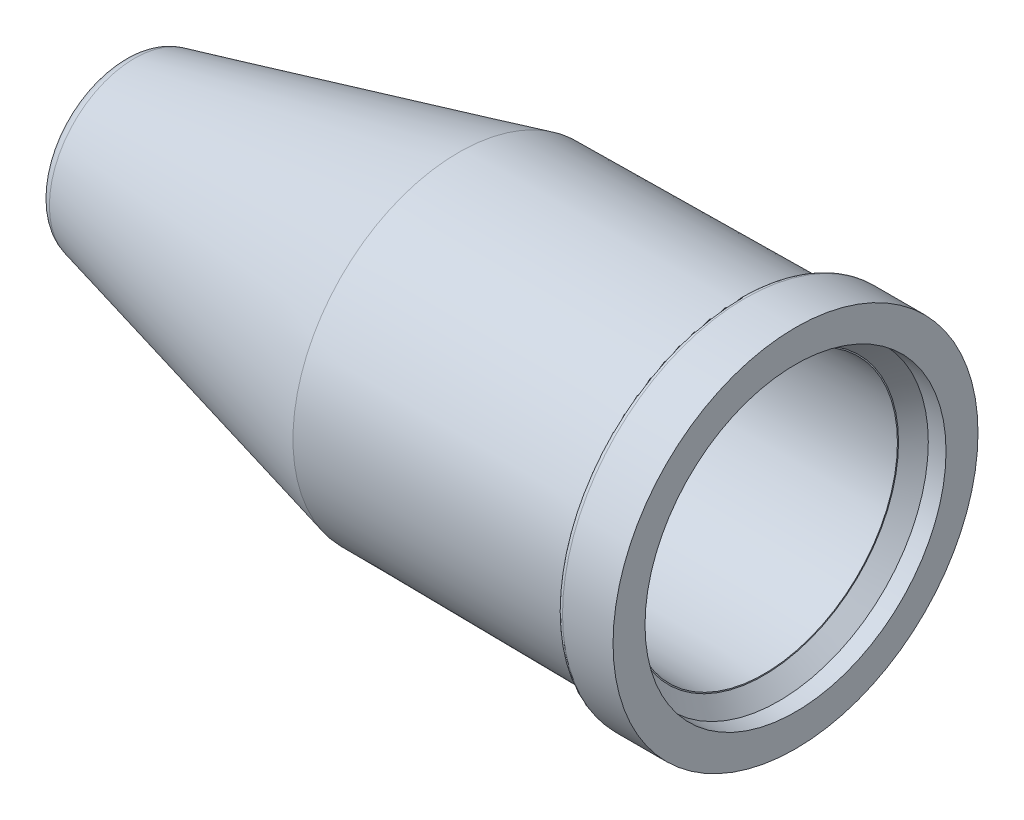
ISO-10303-21;
HEADER;
FILE_DESCRIPTION(('STEP AP214'),'2;1');
FILE_NAME('part.step','',(''),(''),'','','');
FILE_SCHEMA(('AUTOMOTIVE_DESIGN { 1 0 10303 214 1 1 1 1 }'));
ENDSEC;
DATA;
#1=APPLICATION_CONTEXT('core data for automotive mechanical design processes');
#2=APPLICATION_PROTOCOL_DEFINITION('international standard','automotive_design',2000,#1);
#3=PRODUCT_CONTEXT('',#1,'mechanical');
#4=PRODUCT('Part','Part','',(#3));
#5=PRODUCT_RELATED_PRODUCT_CATEGORY('part','',(#4));
#6=PRODUCT_DEFINITION_FORMATION('','',#4);
#7=PRODUCT_DEFINITION_CONTEXT('part definition',#1,'design');
#8=PRODUCT_DEFINITION('design','',#6,#7);
#9=PRODUCT_DEFINITION_SHAPE('','',#8);
#10=(LENGTH_UNIT() NAMED_UNIT(*) SI_UNIT(.MILLI.,.METRE.));
#11=(NAMED_UNIT(*) PLANE_ANGLE_UNIT() SI_UNIT($,.RADIAN.));
#12=(NAMED_UNIT(*) SI_UNIT($,.STERADIAN.) SOLID_ANGLE_UNIT());
#13=UNCERTAINTY_MEASURE_WITH_UNIT(LENGTH_MEASURE(1.E-05),#10,'distance_accuracy_value','');
#14=(GEOMETRIC_REPRESENTATION_CONTEXT(3) GLOBAL_UNCERTAINTY_ASSIGNED_CONTEXT((#13)) GLOBAL_UNIT_ASSIGNED_CONTEXT((#10,
#11,#12)) REPRESENTATION_CONTEXT('',''));
#15=CARTESIAN_POINT('',(0.,0.,0.));
#16=DIRECTION('',(0.,0.,1.));
#17=DIRECTION('',(1.,0.,0.));
#18=AXIS2_PLACEMENT_3D('',#15,#16,#17);
#19=CARTESIAN_POINT('',(-12.,1.45996726,0.));
#20=DIRECTION('',(-1.,0.,0.));
#21=DIRECTION('',(0.,0.,1.));
#22=AXIS2_PLACEMENT_3D('',#19,#20,#21);
#23=PLANE('',#22);
#24=CARTESIAN_POINT('',(-12.,0.,0.));
#25=DIRECTION('',(-1.,0.,0.));
#26=DIRECTION('',(0.,0.,1.));
#27=AXIS2_PLACEMENT_3D('',#24,#25,#26);
#28=CIRCLE('',#27,1.22539441304672);
#29=CARTESIAN_POINT('',(-12.,0.,1.22539441304672));
#30=VERTEX_POINT('',#29);
#31=EDGE_CURVE('E49',#30,#30,#28,.T.);
#32=ORIENTED_EDGE('',*,*,#31,.T.);
#33=EDGE_LOOP('',(#32));
#34=FACE_BOUND('',#33,.T.);
#35=CARTESIAN_POINT('',(-12.,0.,0.));
#36=DIRECTION('',(1.,0.,0.));
#37=DIRECTION('',(0.,0.,-1.));
#38=AXIS2_PLACEMENT_3D('',#35,#36,#37);
#39=CIRCLE('',#38,1.182);
#40=CARTESIAN_POINT('',(-12.,0.,-1.182));
#41=VERTEX_POINT('',#40);
#42=EDGE_CURVE('E135',#41,#41,#39,.T.);
#43=ORIENTED_EDGE('',*,*,#42,.T.);
#44=EDGE_LOOP('',(#43));
#45=FACE_BOUND('',#44,.T.);
#46=ADVANCED_FACE('F34',(#34,#45),#23,.T.);
#47=CARTESIAN_POINT('',(-6.,0.,0.));
#48=DIRECTION('',(1.,0.,0.));
#49=DIRECTION('',(0.,0.,-1.));
#50=AXIS2_PLACEMENT_3D('',#47,#48,#49);
#51=CONICAL_SURFACE('',#50,2.951,0.243571540210647);
#52=CARTESIAN_POINT('',(-11.77235108269,0.,0.));
#53=DIRECTION('',(-1.,0.,0.));
#54=DIRECTION('',(0.,0.,1.));
#55=AXIS2_PLACEMENT_3D('',#52,#53,#54);
#56=CIRCLE('',#55,1.5165392581558);
#57=CARTESIAN_POINT('',(-11.77235108269,0.,1.5165392581558));
#58=VERTEX_POINT('',#57);
#59=EDGE_CURVE('E53',#58,#58,#56,.F.);
#60=ORIENTED_EDGE('',*,*,#59,.T.);
#61=EDGE_LOOP('',(#60));
#62=FACE_BOUND('',#61,.T.);
#63=CARTESIAN_POINT('',(-6.,0.,0.));
#64=DIRECTION('',(1.,0.,0.));
#65=DIRECTION('',(0.,0.,-1.));
#66=AXIS2_PLACEMENT_3D('',#63,#64,#65);
#67=CIRCLE('',#66,2.951);
#68=CARTESIAN_POINT('',(-6.,0.,-2.951));
#69=VERTEX_POINT('',#68);
#70=EDGE_CURVE('E58',#69,#69,#67,.T.);
#71=ORIENTED_EDGE('',*,*,#70,.F.);
#72=EDGE_LOOP('',(#71));
#73=FACE_BOUND('',#72,.T.);
#74=ADVANCED_FACE('F155',(#62,#73),#51,.T.);
#75=CARTESIAN_POINT('',(-1.,0.,0.));
#76=DIRECTION('',(1.,0.,0.));
#77=DIRECTION('',(0.,0.,-1.));
#78=AXIS2_PLACEMENT_3D('',#75,#76,#77);
#79=CONICAL_SURFACE('',#78,3.,0.00979968628741051);
#80=ORIENTED_EDGE('',*,*,#70,.T.);
#81=EDGE_LOOP('',(#80));
#82=FACE_BOUND('',#81,.T.);
#83=CARTESIAN_POINT('',(-1.,0.,0.));
#84=DIRECTION('',(1.,0.,0.));
#85=DIRECTION('',(0.,0.,-1.));
#86=AXIS2_PLACEMENT_3D('',#83,#84,#85);
#87=CIRCLE('',#86,3.);
#88=CARTESIAN_POINT('',(-1.,0.,-3.));
#89=VERTEX_POINT('',#88);
#90=EDGE_CURVE('E62',#89,#89,#87,.T.);
#91=ORIENTED_EDGE('',*,*,#90,.F.);
#92=EDGE_LOOP('',(#91));
#93=FACE_BOUND('',#92,.T.);
#94=ADVANCED_FACE('F161',(#82,#93),#79,.T.);
#95=CARTESIAN_POINT('',(-1.,3.25,0.));
#96=DIRECTION('',(-1.,0.,0.));
#97=DIRECTION('',(0.,0.,1.));
#98=AXIS2_PLACEMENT_3D('',#95,#96,#97);
#99=PLANE('',#98);
#100=CARTESIAN_POINT('',(-1.,0.,0.));
#101=DIRECTION('',(-1.,0.,0.));
#102=DIRECTION('',(0.,0.,1.));
#103=AXIS2_PLACEMENT_3D('',#100,#101,#102);
#104=CIRCLE('',#103,3.15);
#105=CARTESIAN_POINT('',(-1.,0.,3.15));
#106=VERTEX_POINT('',#105);
#107=EDGE_CURVE('E10',#106,#106,#104,.T.);
#108=ORIENTED_EDGE('',*,*,#107,.T.);
#109=EDGE_LOOP('',(#108));
#110=FACE_BOUND('',#109,.T.);
#111=ORIENTED_EDGE('',*,*,#90,.T.);
#112=EDGE_LOOP('',(#111));
#113=FACE_BOUND('',#112,.T.);
#114=ADVANCED_FACE('F167',(#110,#113),#99,.T.);
#115=CARTESIAN_POINT('',(3.,0.,0.));
#116=DIRECTION('',(1.,0.,0.));
#117=DIRECTION('',(0.,0.,-1.));
#118=AXIS2_PLACEMENT_3D('',#115,#116,#117);
#119=CYLINDRICAL_SURFACE('',#118,3.25);
#120=CARTESIAN_POINT('',(-0.9,0.,0.));
#121=DIRECTION('',(-1.,0.,0.));
#122=DIRECTION('',(0.,0.,1.));
#123=AXIS2_PLACEMENT_3D('',#120,#121,#122);
#124=CIRCLE('',#123,3.25);
#125=CARTESIAN_POINT('',(-0.9,0.,3.25));
#126=VERTEX_POINT('',#125);
#127=EDGE_CURVE('E42',#126,#126,#124,.F.);
#128=ORIENTED_EDGE('',*,*,#127,.T.);
#129=EDGE_LOOP('',(#128));
#130=FACE_BOUND('',#129,.T.);
#131=CARTESIAN_POINT('',(0.,0.,0.));
#132=DIRECTION('',(1.,0.,0.));
#133=DIRECTION('',(0.,0.,-1.));
#134=AXIS2_PLACEMENT_3D('',#131,#132,#133);
#135=CIRCLE('',#134,3.25);
#136=CARTESIAN_POINT('',(0.,0.,-3.25));
#137=VERTEX_POINT('',#136);
#138=EDGE_CURVE('E65',#137,#137,#135,.T.);
#139=ORIENTED_EDGE('',*,*,#138,.F.);
#140=EDGE_LOOP('',(#139));
#141=FACE_BOUND('',#140,.T.);
#142=ADVANCED_FACE('F171',(#130,#141),#119,.T.);
#143=CARTESIAN_POINT('',(0.,2.68072233378491,0.));
#144=DIRECTION('',(1.,0.,0.));
#145=DIRECTION('',(0.,0.,-1.));
#146=AXIS2_PLACEMENT_3D('',#143,#144,#145);
#147=PLANE('',#146);
#148=ORIENTED_EDGE('',*,*,#138,.T.);
#149=EDGE_LOOP('',(#148));
#150=FACE_BOUND('',#149,.T.);
#151=CARTESIAN_POINT('',(0.,0.,0.));
#152=DIRECTION('',(1.,0.,0.));
#153=DIRECTION('',(0.,0.,-1.));
#154=AXIS2_PLACEMENT_3D('',#151,#152,#153);
#155=CIRCLE('',#154,2.68072233378491);
#156=CARTESIAN_POINT('',(0.,0.,-2.68072233378491));
#157=VERTEX_POINT('',#156);
#158=EDGE_CURVE('E68',#157,#157,#155,.T.);
#159=ORIENTED_EDGE('',*,*,#158,.F.);
#160=EDGE_LOOP('',(#159));
#161=FACE_BOUND('',#160,.T.);
#162=ADVANCED_FACE('F174',(#150,#161),#147,.T.);
#163=CARTESIAN_POINT('',(-0.3,0.,0.));
#164=DIRECTION('',(1.,0.,0.));
#165=DIRECTION('',(0.,0.,-1.));
#166=AXIS2_PLACEMENT_3D('',#163,#164,#165);
#167=CONICAL_SURFACE('',#166,2.665,0.052359877559822);
#168=ORIENTED_EDGE('',*,*,#158,.T.);
#169=EDGE_LOOP('',(#168));
#170=FACE_BOUND('',#169,.T.);
#171=CARTESIAN_POINT('',(-0.3,0.,0.));
#172=DIRECTION('',(1.,0.,0.));
#173=DIRECTION('',(0.,0.,-1.));
#174=AXIS2_PLACEMENT_3D('',#171,#172,#173);
#175=CIRCLE('',#174,2.665);
#176=CARTESIAN_POINT('',(-0.3,0.,-2.665));
#177=VERTEX_POINT('',#176);
#178=EDGE_CURVE('E71',#177,#177,#175,.T.);
#179=ORIENTED_EDGE('',*,*,#178,.F.);
#180=EDGE_LOOP('',(#179));
#181=FACE_BOUND('',#180,.T.);
#182=ADVANCED_FACE('F177',(#170,#181),#167,.F.);
#183=CARTESIAN_POINT('',(-0.3,0.,0.));
#184=DIRECTION('',(1.,0.,0.));
#185=DIRECTION('',(0.,0.,-1.));
#186=AXIS2_PLACEMENT_3D('',#183,#184,#185);
#187=CONICAL_SURFACE('',#186,2.665,0.785398163397452);
#188=CARTESIAN_POINT('',(-0.564999999999998,0.,0.));
#189=DIRECTION('',(1.,0.,0.));
#190=DIRECTION('',(0.,0.,-1.));
#191=AXIS2_PLACEMENT_3D('',#188,#189,#190);
#192=CIRCLE('',#191,2.4);
#193=CARTESIAN_POINT('',(-0.564999999999998,0.,-2.4));
#194=VERTEX_POINT('',#193);
#195=EDGE_CURVE('E74',#194,#194,#192,.T.);
#196=ORIENTED_EDGE('',*,*,#195,.F.);
#197=EDGE_LOOP('',(#196));
#198=FACE_BOUND('',#197,.T.);
#199=ORIENTED_EDGE('',*,*,#178,.T.);
#200=EDGE_LOOP('',(#199));
#201=FACE_BOUND('',#200,.T.);
#202=ADVANCED_FACE('F181',(#198,#201),#187,.F.);
#203=CARTESIAN_POINT('',(-0.564999999999998,2.38,0.));
#204=DIRECTION('',(1.,0.,0.));
#205=DIRECTION('',(0.,0.,-1.));
#206=AXIS2_PLACEMENT_3D('',#203,#204,#205);
#207=PLANE('',#206);
#208=ORIENTED_EDGE('',*,*,#195,.T.);
#209=EDGE_LOOP('',(#208));
#210=FACE_BOUND('',#209,.T.);
#211=CARTESIAN_POINT('',(-0.564999999999998,0.,0.));
#212=DIRECTION('',(1.,0.,0.));
#213=DIRECTION('',(0.,0.,-1.));
#214=AXIS2_PLACEMENT_3D('',#211,#212,#213);
#215=CIRCLE('',#214,2.38);
#216=CARTESIAN_POINT('',(-0.564999999999998,0.,-2.38));
#217=VERTEX_POINT('',#216);
#218=EDGE_CURVE('E77',#217,#217,#215,.T.);
#219=ORIENTED_EDGE('',*,*,#218,.F.);
#220=EDGE_LOOP('',(#219));
#221=FACE_BOUND('',#220,.T.);
#222=ADVANCED_FACE('F185',(#210,#221),#207,.T.);
#223=CARTESIAN_POINT('',(-6.81,0.,0.));
#224=DIRECTION('',(1.,0.,0.));
#225=DIRECTION('',(0.,0.,-1.));
#226=AXIS2_PLACEMENT_3D('',#223,#224,#225);
#227=CONICAL_SURFACE('',#226,2.32675113436465,0.00852643318342214);
#228=ORIENTED_EDGE('',*,*,#218,.T.);
#229=EDGE_LOOP('',(#228));
#230=FACE_BOUND('',#229,.T.);
#231=CARTESIAN_POINT('',(-6.81,0.,0.));
#232=DIRECTION('',(1.,0.,0.));
#233=DIRECTION('',(0.,0.,-1.));
#234=AXIS2_PLACEMENT_3D('',#231,#232,#233);
#235=CIRCLE('',#234,2.32675113436465);
#236=CARTESIAN_POINT('',(-6.81,0.,-2.32675113436465));
#237=VERTEX_POINT('',#236);
#238=EDGE_CURVE('E80',#237,#237,#235,.T.);
#239=ORIENTED_EDGE('',*,*,#238,.F.);
#240=EDGE_LOOP('',(#239));
#241=FACE_BOUND('',#240,.T.);
#242=ADVANCED_FACE('F189',(#230,#241),#227,.F.);
#243=CARTESIAN_POINT('',(-6.81,0.,0.));
#244=DIRECTION('',(1.,0.,0.));
#245=DIRECTION('',(0.,0.,-1.));
#246=AXIS2_PLACEMENT_3D('',#243,#244,#245);
#247=CONICAL_SURFACE('',#246,2.32675113436465,0.270526034059121);
#248=CARTESIAN_POINT('',(-7.5,0.,0.));
#249=DIRECTION('',(1.,0.,0.));
#250=DIRECTION('',(0.,0.,-1.));
#251=AXIS2_PLACEMENT_3D('',#248,#249,#250);
#252=CIRCLE('',#251,2.13539719896336);
#253=CARTESIAN_POINT('',(-7.5,0.,-2.13539719896336));
#254=VERTEX_POINT('',#253);
#255=EDGE_CURVE('E83',#254,#254,#252,.T.);
#256=ORIENTED_EDGE('',*,*,#255,.F.);
#257=EDGE_LOOP('',(#256));
#258=FACE_BOUND('',#257,.T.);
#259=ORIENTED_EDGE('',*,*,#238,.T.);
#260=EDGE_LOOP('',(#259));
#261=FACE_BOUND('',#260,.T.);
#262=ADVANCED_FACE('F193',(#258,#261),#247,.F.);
#263=CARTESIAN_POINT('',(-7.89008195503873,0.,0.));
#264=DIRECTION('',(1.,0.,0.));
#265=DIRECTION('',(0.,0.,-1.));
#266=AXIS2_PLACEMENT_3D('',#263,#264,#265);
#267=TOROIDAL_SURFACE('',#266,2.4319373621001,0.489999999999999);
#268=ORIENTED_EDGE('',*,*,#255,.T.);
#269=EDGE_LOOP('',(#268));
#270=FACE_BOUND('',#269,.T.);
#271=CARTESIAN_POINT('',(-8.07171797673641,0.,0.));
#272=DIRECTION('',(1.,0.,0.));
#273=DIRECTION('',(0.,0.,-1.));
#274=AXIS2_PLACEMENT_3D('',#271,#272,#273);
#275=CIRCLE('',#274,1.97684577173412);
#276=CARTESIAN_POINT('',(-8.07171797673641,0.,-1.97684577173412));
#277=VERTEX_POINT('',#276);
#278=EDGE_CURVE('E86',#277,#277,#275,.T.);
#279=ORIENTED_EDGE('',*,*,#278,.F.);
#280=EDGE_LOOP('',(#279));
#281=FACE_BOUND('',#280,.T.);
#282=ADVANCED_FACE('F197',(#270,#281),#267,.T.);
#283=CARTESIAN_POINT('',(-9.53,0.,0.));
#284=DIRECTION('',(1.,0.,0.));
#285=DIRECTION('',(0.,0.,-1.));
#286=AXIS2_PLACEMENT_3D('',#283,#284,#285);
#287=CONICAL_SURFACE('',#286,1.57242837452189,0.270526034059122);
#288=ORIENTED_EDGE('',*,*,#278,.T.);
#289=EDGE_LOOP('',(#288));
#290=FACE_BOUND('',#289,.T.);
#291=CARTESIAN_POINT('',(-9.53,0.,0.));
#292=DIRECTION('',(1.,0.,0.));
#293=DIRECTION('',(0.,0.,-1.));
#294=AXIS2_PLACEMENT_3D('',#291,#292,#293);
#295=CIRCLE('',#294,1.57242837452189);
#296=CARTESIAN_POINT('',(-9.53,0.,-1.57242837452189));
#297=VERTEX_POINT('',#296);
#298=EDGE_CURVE('E89',#297,#297,#295,.T.);
#299=ORIENTED_EDGE('',*,*,#298,.F.);
#300=EDGE_LOOP('',(#299));
#301=FACE_BOUND('',#300,.T.);
#302=ADVANCED_FACE('F201',(#290,#301),#287,.F.);
#303=CARTESIAN_POINT('',(-9.53,1.475,0.));
#304=DIRECTION('',(1.,0.,0.));
#305=DIRECTION('',(0.,0.,-1.));
#306=AXIS2_PLACEMENT_3D('',#303,#304,#305);
#307=PLANE('',#306);
#308=ORIENTED_EDGE('',*,*,#298,.T.);
#309=EDGE_LOOP('',(#308));
#310=FACE_BOUND('',#309,.T.);
#311=CARTESIAN_POINT('',(-9.53,0.,0.));
#312=DIRECTION('',(1.,0.,0.));
#313=DIRECTION('',(0.,0.,-1.));
#314=AXIS2_PLACEMENT_3D('',#311,#312,#313);
#315=CIRCLE('',#314,1.475);
#316=CARTESIAN_POINT('',(-9.53,0.,-1.475));
#317=VERTEX_POINT('',#316);
#318=EDGE_CURVE('E92',#317,#317,#315,.T.);
#319=ORIENTED_EDGE('',*,*,#318,.F.);
#320=EDGE_LOOP('',(#319));
#321=FACE_BOUND('',#320,.T.);
#322=ADVANCED_FACE('F205',(#310,#321),#307,.T.);
#323=CARTESIAN_POINT('',(3.,0.,0.));
#324=DIRECTION('',(1.,0.,0.));
#325=DIRECTION('',(0.,0.,-1.));
#326=AXIS2_PLACEMENT_3D('',#323,#324,#325);
#327=CYLINDRICAL_SURFACE('',#326,1.475);
#328=CARTESIAN_POINT('',(-7.28,0.,0.));
#329=DIRECTION('',(1.,0.,0.));
#330=DIRECTION('',(0.,0.,-1.));
#331=AXIS2_PLACEMENT_3D('',#328,#329,#330);
#332=CIRCLE('',#331,1.475);
#333=CARTESIAN_POINT('',(-7.28,0.,-1.475));
#334=VERTEX_POINT('',#333);
#335=EDGE_CURVE('E95',#334,#334,#332,.T.);
#336=ORIENTED_EDGE('',*,*,#335,.F.);
#337=EDGE_LOOP('',(#336));
#338=FACE_BOUND('',#337,.T.);
#339=ORIENTED_EDGE('',*,*,#318,.T.);
#340=EDGE_LOOP('',(#339));
#341=FACE_BOUND('',#340,.T.);
#342=ADVANCED_FACE('F209',(#338,#341),#327,.T.);
#343=CARTESIAN_POINT('',(-7.28,1.10837438423645,0.));
#344=DIRECTION('',(1.,0.,0.));
#345=DIRECTION('',(0.,0.,-1.));
#346=AXIS2_PLACEMENT_3D('',#343,#344,#345);
#347=PLANE('',#346);
#348=CARTESIAN_POINT('',(-7.28,0.,0.));
#349=DIRECTION('',(1.,0.,0.));
#350=DIRECTION('',(0.,0.,-1.));
#351=AXIS2_PLACEMENT_3D('',#348,#349,#350);
#352=CIRCLE('',#351,1.10837438423645);
#353=CARTESIAN_POINT('',(-7.28,0.,-1.10837438423645));
#354=VERTEX_POINT('',#353);
#355=EDGE_CURVE('E98',#354,#354,#352,.T.);
#356=ORIENTED_EDGE('',*,*,#355,.F.);
#357=EDGE_LOOP('',(#356));
#358=FACE_BOUND('',#357,.T.);
#359=ORIENTED_EDGE('',*,*,#335,.T.);
#360=EDGE_LOOP('',(#359));
#361=FACE_BOUND('',#360,.T.);
#362=ADVANCED_FACE('F213',(#358,#361),#347,.T.);
#363=CARTESIAN_POINT('',(-7.28,0.,0.));
#364=DIRECTION('',(-1.,0.,0.));
#365=DIRECTION('',(0.,0.,1.));
#366=AXIS2_PLACEMENT_3D('',#363,#364,#365);
#367=CONICAL_SURFACE('',#366,1.10837438423645,0.0109592132614739);
#368=CARTESIAN_POINT('',(-3.68418629360444,0.,0.));
#369=DIRECTION('',(1.,0.,0.));
#370=DIRECTION('',(0.,0.,-1.));
#371=AXIS2_PLACEMENT_3D('',#368,#369,#370);
#372=CIRCLE('',#371,1.06896551724138);
#373=CARTESIAN_POINT('',(-3.68418629360444,0.,-1.06896551724138));
#374=VERTEX_POINT('',#373);
#375=EDGE_CURVE('E101',#374,#374,#372,.T.);
#376=ORIENTED_EDGE('',*,*,#375,.F.);
#377=EDGE_LOOP('',(#376));
#378=FACE_BOUND('',#377,.T.);
#379=ORIENTED_EDGE('',*,*,#355,.T.);
#380=EDGE_LOOP('',(#379));
#381=FACE_BOUND('',#380,.T.);
#382=ADVANCED_FACE('F217',(#378,#381),#367,.T.);
#383=CARTESIAN_POINT('',(-2.96034602572839,0.,0.));
#384=DIRECTION('',(-1.,0.,0.));
#385=DIRECTION('',(0.,0.,1.));
#386=AXIS2_PLACEMENT_3D('',#383,#384,#385);
#387=CONICAL_SURFACE('',#386,0.805509205371221,0.349065850398866);
#388=ORIENTED_EDGE('',*,*,#375,.T.);
#389=EDGE_LOOP('',(#388));
#390=FACE_BOUND('',#389,.T.);
#391=CARTESIAN_POINT('',(-2.96034602572839,0.,0.));
#392=DIRECTION('',(1.,0.,0.));
#393=DIRECTION('',(0.,0.,-1.));
#394=AXIS2_PLACEMENT_3D('',#391,#392,#393);
#395=CIRCLE('',#394,0.805509205371221);
#396=CARTESIAN_POINT('',(-2.96034602572839,0.,-0.805509205371221));
#397=VERTEX_POINT('',#396);
#398=EDGE_CURVE('E104',#397,#397,#395,.T.);
#399=ORIENTED_EDGE('',*,*,#398,.F.);
#400=EDGE_LOOP('',(#399));
#401=FACE_BOUND('',#400,.T.);
#402=ADVANCED_FACE('F221',(#390,#401),#387,.T.);
#403=CARTESIAN_POINT('',(-2.96034602572839,0.4728,0.));
#404=DIRECTION('',(1.,0.,0.));
#405=DIRECTION('',(0.,0.,-1.));
#406=AXIS2_PLACEMENT_3D('',#403,#404,#405);
#407=PLANE('',#406);
#408=ORIENTED_EDGE('',*,*,#398,.T.);
#409=EDGE_LOOP('',(#408));
#410=FACE_BOUND('',#409,.T.);
#411=CARTESIAN_POINT('',(-2.96034602572839,0.,0.));
#412=DIRECTION('',(1.,0.,0.));
#413=DIRECTION('',(0.,0.,-1.));
#414=AXIS2_PLACEMENT_3D('',#411,#412,#413);
#415=CIRCLE('',#414,0.4728);
#416=CARTESIAN_POINT('',(-2.96034602572839,0.,-0.4728));
#417=VERTEX_POINT('',#416);
#418=EDGE_CURVE('E107',#417,#417,#415,.T.);
#419=ORIENTED_EDGE('',*,*,#418,.F.);
#420=EDGE_LOOP('',(#419));
#421=FACE_BOUND('',#420,.T.);
#422=ADVANCED_FACE('F225',(#410,#421),#407,.T.);
#423=CARTESIAN_POINT('',(-3.52765411453455,0.,0.));
#424=DIRECTION('',(-1.,0.,0.));
#425=DIRECTION('',(0.,0.,1.));
#426=AXIS2_PLACEMENT_3D('',#423,#424,#425);
#427=CONICAL_SURFACE('',#426,0.492610835,0.0349065850398796);
#428=ORIENTED_EDGE('',*,*,#418,.T.);
#429=EDGE_LOOP('',(#428));
#430=FACE_BOUND('',#429,.T.);
#431=CARTESIAN_POINT('',(-3.52765411453455,0.,0.));
#432=DIRECTION('',(1.,0.,0.));
#433=DIRECTION('',(0.,0.,-1.));
#434=AXIS2_PLACEMENT_3D('',#431,#432,#433);
#435=CIRCLE('',#434,0.492610835);
#436=CARTESIAN_POINT('',(-3.52765411453455,0.,-0.492610835));
#437=VERTEX_POINT('',#436);
#438=EDGE_CURVE('E110',#437,#437,#435,.T.);
#439=ORIENTED_EDGE('',*,*,#438,.F.);
#440=EDGE_LOOP('',(#439));
#441=FACE_BOUND('',#440,.T.);
#442=ADVANCED_FACE('F229',(#430,#441),#427,.F.);
#443=CARTESIAN_POINT('',(3.,0.,0.));
#444=DIRECTION('',(1.,0.,0.));
#445=DIRECTION('',(0.,0.,-1.));
#446=AXIS2_PLACEMENT_3D('',#443,#444,#445);
#447=CYLINDRICAL_SURFACE('',#446,0.492610835);
#448=ORIENTED_EDGE('',*,*,#438,.T.);
#449=EDGE_LOOP('',(#448));
#450=FACE_BOUND('',#449,.T.);
#451=CARTESIAN_POINT('',(-7.85221674876848,0.,0.));
#452=DIRECTION('',(1.,0.,0.));
#453=DIRECTION('',(0.,0.,-1.));
#454=AXIS2_PLACEMENT_3D('',#451,#452,#453);
#455=CIRCLE('',#454,0.492610835);
#456=CARTESIAN_POINT('',(-7.85221674876848,0.,-0.492610835));
#457=VERTEX_POINT('',#456);
#458=EDGE_CURVE('E113',#457,#457,#455,.T.);
#459=ORIENTED_EDGE('',*,*,#458,.F.);
#460=EDGE_LOOP('',(#459));
#461=FACE_BOUND('',#460,.T.);
#462=ADVANCED_FACE('F233',(#450,#461),#447,.F.);
#463=CARTESIAN_POINT('',(-7.85221674876848,0.762074458379734,0.));
#464=DIRECTION('',(-1.,0.,0.));
#465=DIRECTION('',(0.,0.,1.));
#466=AXIS2_PLACEMENT_3D('',#463,#464,#465);
#467=PLANE('',#466);
#468=ORIENTED_EDGE('',*,*,#458,.T.);
#469=EDGE_LOOP('',(#468));
#470=FACE_BOUND('',#469,.T.);
#471=CARTESIAN_POINT('',(-7.85221674876848,0.,0.));
#472=DIRECTION('',(1.,0.,0.));
#473=DIRECTION('',(0.,0.,-1.));
#474=AXIS2_PLACEMENT_3D('',#471,#472,#473);
#475=CIRCLE('',#474,0.762074458379734);
#476=CARTESIAN_POINT('',(-7.85221674876848,0.,-0.762074458379734));
#477=VERTEX_POINT('',#476);
#478=EDGE_CURVE('E116',#477,#477,#475,.T.);
#479=ORIENTED_EDGE('',*,*,#478,.F.);
#480=EDGE_LOOP('',(#479));
#481=FACE_BOUND('',#480,.T.);
#482=ADVANCED_FACE('F237',(#470,#481),#467,.T.);
#483=CARTESIAN_POINT('',(-7.95221674876848,0.,0.));
#484=DIRECTION('',(1.,0.,0.));
#485=DIRECTION('',(0.,0.,-1.));
#486=AXIS2_PLACEMENT_3D('',#483,#484,#485);
#487=TOROIDAL_SURFACE('',#486,0.762074458379734,0.0999999999999997);
#488=CARTESIAN_POINT('',(-7.95116863506904,0.,0.));
#489=DIRECTION('',(1.,0.,0.));
#490=DIRECTION('',(0.,0.,-1.));
#491=AXIS2_PLACEMENT_3D('',#488,#489,#490);
#492=CIRCLE('',#491,0.862068965517242);
#493=CARTESIAN_POINT('',(-7.95116863506904,0.,-0.862068965517242));
#494=VERTEX_POINT('',#493);
#495=EDGE_CURVE('E119',#494,#494,#492,.T.);
#496=ORIENTED_EDGE('',*,*,#495,.F.);
#497=EDGE_LOOP('',(#496));
#498=FACE_BOUND('',#497,.T.);
#499=ORIENTED_EDGE('',*,*,#478,.T.);
#500=EDGE_LOOP('',(#499));
#501=FACE_BOUND('',#500,.T.);
#502=ADVANCED_FACE('F241',(#498,#501),#487,.F.);
#503=CARTESIAN_POINT('',(-11.5482167487685,0.,0.));
#504=DIRECTION('',(-1.,0.,0.));
#505=DIRECTION('',(0.,0.,1.));
#506=AXIS2_PLACEMENT_3D('',#503,#504,#505);
#507=CONICAL_SURFACE('',#506,0.911125,0.0136370134458708);
#508=ORIENTED_EDGE('',*,*,#495,.T.);
#509=EDGE_LOOP('',(#508));
#510=FACE_BOUND('',#509,.T.);
#511=CARTESIAN_POINT('',(-11.5482167487685,0.,0.));
#512=DIRECTION('',(1.,0.,0.));
#513=DIRECTION('',(0.,0.,-1.));
#514=AXIS2_PLACEMENT_3D('',#511,#512,#513);
#515=CIRCLE('',#514,0.911125);
#516=CARTESIAN_POINT('',(-11.5482167487685,0.,-0.911125));
#517=VERTEX_POINT('',#516);
#518=EDGE_CURVE('E122',#517,#517,#515,.T.);
#519=ORIENTED_EDGE('',*,*,#518,.F.);
#520=EDGE_LOOP('',(#519));
#521=FACE_BOUND('',#520,.T.);
#522=ADVANCED_FACE('F245',(#510,#521),#507,.F.);
#523=CARTESIAN_POINT('',(-11.5482167487685,1.01467233096217,0.));
#524=DIRECTION('',(-1.,0.,0.));
#525=DIRECTION('',(0.,0.,1.));
#526=AXIS2_PLACEMENT_3D('',#523,#524,#525);
#527=PLANE('',#526);
#528=ORIENTED_EDGE('',*,*,#518,.T.);
#529=EDGE_LOOP('',(#528));
#530=FACE_BOUND('',#529,.T.);
#531=CARTESIAN_POINT('',(-11.5482167487685,0.,0.));
#532=DIRECTION('',(1.,0.,0.));
#533=DIRECTION('',(0.,0.,-1.));
#534=AXIS2_PLACEMENT_3D('',#531,#532,#533);
#535=CIRCLE('',#534,1.01467233096217);
#536=CARTESIAN_POINT('',(-11.5482167487685,0.,-1.01467233096217));
#537=VERTEX_POINT('',#536);
#538=EDGE_CURVE('E125',#537,#537,#535,.T.);
#539=ORIENTED_EDGE('',*,*,#538,.F.);
#540=EDGE_LOOP('',(#539));
#541=FACE_BOUND('',#540,.T.);
#542=ADVANCED_FACE('F249',(#530,#541),#527,.T.);
#543=CARTESIAN_POINT('',(-11.6482167487685,0.,0.));
#544=DIRECTION('',(1.,0.,0.));
#545=DIRECTION('',(0.,0.,-1.));
#546=AXIS2_PLACEMENT_3D('',#543,#544,#545);
#547=TOROIDAL_SURFACE('',#546,1.01467233096217,0.100000000000001);
#548=ORIENTED_EDGE('',*,*,#538,.T.);
#549=EDGE_LOOP('',(#548));
#550=FACE_BOUND('',#549,.T.);
#551=CARTESIAN_POINT('',(-11.6266549304012,0.,0.));
#552=DIRECTION('',(1.,0.,0.));
#553=DIRECTION('',(0.,0.,-1.));
#554=AXIS2_PLACEMENT_3D('',#551,#552,#553);
#555=CIRCLE('',#554,1.11232010609657);
#556=CARTESIAN_POINT('',(-11.6266549304012,0.,-1.11232010609657));
#557=VERTEX_POINT('',#556);
#558=EDGE_CURVE('E129',#557,#557,#555,.T.);
#559=ORIENTED_EDGE('',*,*,#558,.F.);
#560=EDGE_LOOP('',(#559));
#561=FACE_BOUND('',#560,.T.);
#562=ADVANCED_FACE('F151',(#550,#561),#547,.F.);
#563=CARTESIAN_POINT('',(-11.9422167487685,0.,0.));
#564=DIRECTION('',(-1.,0.,0.));
#565=DIRECTION('',(0.,0.,1.));
#566=AXIS2_PLACEMENT_3D('',#563,#564,#565);
#567=CONICAL_SURFACE('',#566,1.182,0.217324860661828);
#568=ORIENTED_EDGE('',*,*,#558,.T.);
#569=EDGE_LOOP('',(#568));
#570=FACE_BOUND('',#569,.T.);
#571=CARTESIAN_POINT('',(-11.9422167487685,0.,0.));
#572=DIRECTION('',(1.,0.,0.));
#573=DIRECTION('',(0.,0.,-1.));
#574=AXIS2_PLACEMENT_3D('',#571,#572,#573);
#575=CIRCLE('',#574,1.182);
#576=CARTESIAN_POINT('',(-11.9422167487685,0.,-1.182));
#577=VERTEX_POINT('',#576);
#578=EDGE_CURVE('E132',#577,#577,#575,.T.);
#579=ORIENTED_EDGE('',*,*,#578,.F.);
#580=EDGE_LOOP('',(#579));
#581=FACE_BOUND('',#580,.T.);
#582=ADVANCED_FACE('F143',(#570,#581),#567,.F.);
#583=CARTESIAN_POINT('',(3.,0.,0.));
#584=DIRECTION('',(1.,0.,0.));
#585=DIRECTION('',(0.,0.,-1.));
#586=AXIS2_PLACEMENT_3D('',#583,#584,#585);
#587=CYLINDRICAL_SURFACE('',#586,1.182);
#588=ORIENTED_EDGE('',*,*,#578,.T.);
#589=EDGE_LOOP('',(#588));
#590=FACE_BOUND('',#589,.T.);
#591=ORIENTED_EDGE('',*,*,#42,.F.);
#592=EDGE_LOOP('',(#591));
#593=FACE_BOUND('',#592,.T.);
#594=ADVANCED_FACE('F140',(#590,#593),#587,.F.);
#595=CARTESIAN_POINT('',(-11.7,0.,0.));
#596=DIRECTION('',(-1.,0.,0.));
#597=DIRECTION('',(0.,0.,1.));
#598=AXIS2_PLACEMENT_3D('',#595,#596,#597);
#599=TOROIDAL_SURFACE('',#598,1.22539441304672,0.3);
#600=ORIENTED_EDGE('',*,*,#31,.F.);
#601=EDGE_LOOP('',(#600));
#602=FACE_BOUND('',#601,.T.);
#603=ORIENTED_EDGE('',*,*,#59,.F.);
#604=EDGE_LOOP('',(#603));
#605=FACE_BOUND('',#604,.T.);
#606=ADVANCED_FACE('F142',(#602,#605),#599,.T.);
#607=CARTESIAN_POINT('',(-0.9,0.,0.));
#608=DIRECTION('',(-1.,0.,0.));
#609=DIRECTION('',(0.,0.,1.));
#610=AXIS2_PLACEMENT_3D('',#607,#608,#609);
#611=TOROIDAL_SURFACE('',#610,3.15,0.1);
#612=ORIENTED_EDGE('',*,*,#107,.F.);
#613=EDGE_LOOP('',(#612));
#614=FACE_BOUND('',#613,.T.);
#615=ORIENTED_EDGE('',*,*,#127,.F.);
#616=EDGE_LOOP('',(#615));
#617=FACE_BOUND('',#616,.T.);
#618=ADVANCED_FACE('F36',(#614,#617),#611,.T.);
#619=CLOSED_SHELL('',(#46,#74,#94,#114,#142,#162,#182,#202,#222,#242,#262,#282,#302,#322,#342,
#362,#382,#402,#422,#442,#462,#482,#502,#522,#542,#562,#582,#594,#606,#618));
#620=MANIFOLD_SOLID_BREP('B2',#619);
#621=ADVANCED_BREP_SHAPE_REPRESENTATION('',(#18,#620),#14);
#622=SHAPE_DEFINITION_REPRESENTATION(#9,#621);
ENDSEC;
END-ISO-10303-21;
